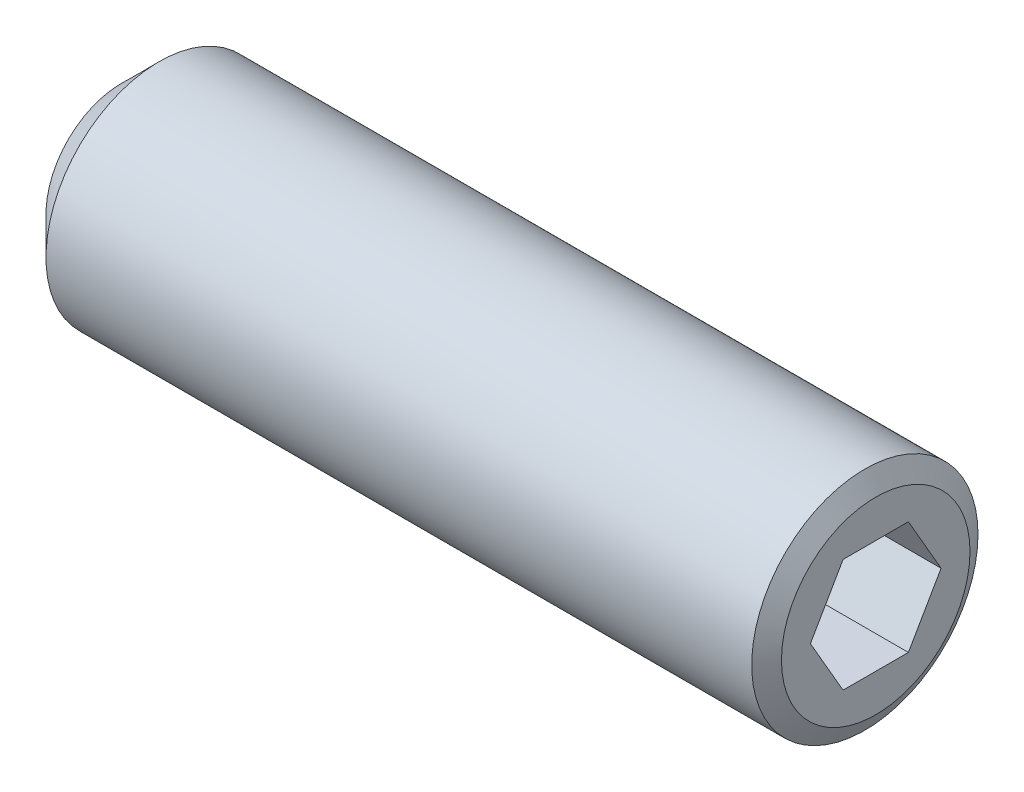
ISO-10303-21;
HEADER;
FILE_DESCRIPTION(('STEP AP214'),'2;1');
FILE_NAME('part.step','',(''),(''),'','','');
FILE_SCHEMA(('AUTOMOTIVE_DESIGN { 1 0 10303 214 1 1 1 1 }'));
ENDSEC;
DATA;
#1=APPLICATION_CONTEXT('core data for automotive mechanical design processes');
#2=APPLICATION_PROTOCOL_DEFINITION('international standard','automotive_design',2000,#1);
#3=PRODUCT_CONTEXT('',#1,'mechanical');
#4=PRODUCT('Part','Part','',(#3));
#5=PRODUCT_RELATED_PRODUCT_CATEGORY('part','',(#4));
#6=PRODUCT_DEFINITION_FORMATION('','',#4);
#7=PRODUCT_DEFINITION_CONTEXT('part definition',#1,'design');
#8=PRODUCT_DEFINITION('design','',#6,#7);
#9=PRODUCT_DEFINITION_SHAPE('','',#8);
#10=(LENGTH_UNIT() NAMED_UNIT(*) SI_UNIT(.MILLI.,.METRE.));
#11=(NAMED_UNIT(*) PLANE_ANGLE_UNIT() SI_UNIT($,.RADIAN.));
#12=(NAMED_UNIT(*) SI_UNIT($,.STERADIAN.) SOLID_ANGLE_UNIT());
#13=UNCERTAINTY_MEASURE_WITH_UNIT(LENGTH_MEASURE(1.E-05),#10,'distance_accuracy_value','');
#14=(GEOMETRIC_REPRESENTATION_CONTEXT(3) GLOBAL_UNCERTAINTY_ASSIGNED_CONTEXT((#13)) GLOBAL_UNIT_ASSIGNED_CONTEXT((#10,
#11,#12)) REPRESENTATION_CONTEXT('',''));
#15=CARTESIAN_POINT('',(0.,0.,0.));
#16=DIRECTION('',(0.,0.,1.));
#17=DIRECTION('',(1.,0.,0.));
#18=AXIS2_PLACEMENT_3D('',#15,#16,#17);
#19=CARTESIAN_POINT('',(0.,0.,0.));
#20=DIRECTION('',(1.,0.,0.));
#21=DIRECTION('',(0.,0.,-1.));
#22=AXIS2_PLACEMENT_3D('',#19,#20,#21);
#23=PLANE('',#22);
#24=CARTESIAN_POINT('',(0.,0.,0.));
#25=DIRECTION('',(1.,0.,0.));
#26=DIRECTION('',(0.,0.,-1.));
#27=AXIS2_PLACEMENT_3D('',#24,#25,#26);
#28=CIRCLE('',#27,2.5);
#29=CARTESIAN_POINT('',(0.,0.,-2.5));
#30=VERTEX_POINT('',#29);
#31=EDGE_CURVE('E44',#30,#30,#28,.T.);
#32=ORIENTED_EDGE('',*,*,#31,.T.);
#33=EDGE_LOOP('',(#32));
#34=FACE_BOUND('',#33,.T.);
#35=DIRECTION('',(0.,0.866025403784439,-0.5));
#36=VECTOR('',#35,1.);
#37=CARTESIAN_POINT('',(0.,-1.5,-0.86602540378444));
#38=LINE('',#37,#36);
#39=CARTESIAN_POINT('',(0.,-1.5,-0.86602540378444));
#40=VERTEX_POINT('',#39);
#41=CARTESIAN_POINT('',(0.,0.,-1.73205080756888));
#42=VERTEX_POINT('',#41);
#43=EDGE_CURVE('E51',#40,#42,#38,.T.);
#44=ORIENTED_EDGE('',*,*,#43,.F.);
#45=DIRECTION('',(0.,0.,-1.));
#46=VECTOR('',#45,1.);
#47=CARTESIAN_POINT('',(0.,-1.5,0.866025403784438));
#48=LINE('',#47,#46);
#49=CARTESIAN_POINT('',(0.,-1.5,0.866025403784438));
#50=VERTEX_POINT('',#49);
#51=EDGE_CURVE('E134',#50,#40,#48,.T.);
#52=ORIENTED_EDGE('',*,*,#51,.F.);
#53=DIRECTION('',(0.,-0.866025403784438,-0.5));
#54=VECTOR('',#53,1.);
#55=CARTESIAN_POINT('',(0.,0.,1.73205080756888));
#56=LINE('',#55,#54);
#57=CARTESIAN_POINT('',(0.,0.,1.73205080756888));
#58=VERTEX_POINT('',#57);
#59=EDGE_CURVE('E132',#58,#50,#56,.T.);
#60=ORIENTED_EDGE('',*,*,#59,.F.);
#61=DIRECTION('',(0.,-0.866025403784439,0.5));
#62=VECTOR('',#61,1.);
#63=CARTESIAN_POINT('',(0.,1.5,0.866025403784439));
#64=LINE('',#63,#62);
#65=CARTESIAN_POINT('',(0.,1.5,0.866025403784439));
#66=VERTEX_POINT('',#65);
#67=EDGE_CURVE('E99',#66,#58,#64,.T.);
#68=ORIENTED_EDGE('',*,*,#67,.F.);
#69=DIRECTION('',(0.,0.,1.));
#70=VECTOR('',#69,1.);
#71=CARTESIAN_POINT('',(0.,1.5,-0.866025403784439));
#72=LINE('',#71,#70);
#73=CARTESIAN_POINT('',(0.,1.5,-0.866025403784439));
#74=VERTEX_POINT('',#73);
#75=EDGE_CURVE('E128',#74,#66,#72,.T.);
#76=ORIENTED_EDGE('',*,*,#75,.F.);
#77=DIRECTION('',(0.,0.866025403784439,0.5));
#78=VECTOR('',#77,1.);
#79=CARTESIAN_POINT('',(0.,0.,-1.73205080756888));
#80=LINE('',#79,#78);
#81=EDGE_CURVE('E125',#42,#74,#80,.T.);
#82=ORIENTED_EDGE('',*,*,#81,.F.);
#83=EDGE_LOOP('',(#44,#52,#60,#68,#76,#82));
#84=FACE_BOUND('',#83,.T.);
#85=ADVANCED_FACE('F36',(#34,#84),#23,.T.);
#86=CARTESIAN_POINT('',(0.,0.,0.));
#87=DIRECTION('',(1.,0.,0.));
#88=DIRECTION('',(0.,0.,-1.));
#89=AXIS2_PLACEMENT_3D('',#86,#87,#88);
#90=CYLINDRICAL_SURFACE('',#89,3.);
#91=CARTESIAN_POINT('',(-0.288675134594812,0.,0.));
#92=DIRECTION('',(1.,0.,0.));
#93=DIRECTION('',(0.,0.,-1.));
#94=AXIS2_PLACEMENT_3D('',#91,#92,#93);
#95=CIRCLE('',#94,3.);
#96=CARTESIAN_POINT('',(-0.288675134594812,0.,-3.));
#97=VERTEX_POINT('',#96);
#98=EDGE_CURVE('E11',#97,#97,#95,.F.);
#99=ORIENTED_EDGE('',*,*,#98,.T.);
#100=EDGE_LOOP('',(#99));
#101=FACE_BOUND('',#100,.T.);
#102=CARTESIAN_POINT('',(-19.,0.,0.));
#103=DIRECTION('',(1.,0.,0.));
#104=DIRECTION('',(0.,0.,-1.));
#105=AXIS2_PLACEMENT_3D('',#102,#103,#104);
#106=CIRCLE('',#105,3.);
#107=CARTESIAN_POINT('',(-19.,0.,-3.));
#108=VERTEX_POINT('',#107);
#109=EDGE_CURVE('E146',#108,#108,#106,.T.);
#110=ORIENTED_EDGE('',*,*,#109,.T.);
#111=EDGE_LOOP('',(#110));
#112=FACE_BOUND('',#111,.T.);
#113=ADVANCED_FACE('F162',(#101,#112),#90,.T.);
#114=CARTESIAN_POINT('',(-19.,0.,0.));
#115=DIRECTION('',(1.,0.,0.));
#116=DIRECTION('',(0.,0.,-1.));
#117=AXIS2_PLACEMENT_3D('',#114,#115,#116);
#118=CONICAL_SURFACE('',#117,3.,0.785398163397453);
#119=CARTESIAN_POINT('',(-20.,0.,0.));
#120=DIRECTION('',(1.,0.,0.));
#121=DIRECTION('',(0.,0.,-1.));
#122=AXIS2_PLACEMENT_3D('',#119,#120,#121);
#123=CIRCLE('',#122,2.);
#124=CARTESIAN_POINT('',(-20.,0.,-2.));
#125=VERTEX_POINT('',#124);
#126=EDGE_CURVE('E138',#125,#125,#123,.T.);
#127=ORIENTED_EDGE('',*,*,#126,.T.);
#128=EDGE_LOOP('',(#127));
#129=FACE_BOUND('',#128,.T.);
#130=ORIENTED_EDGE('',*,*,#109,.F.);
#131=EDGE_LOOP('',(#130));
#132=FACE_BOUND('',#131,.T.);
#133=ADVANCED_FACE('F166',(#129,#132),#118,.T.);
#134=CARTESIAN_POINT('',(-20.,2.,0.));
#135=DIRECTION('',(-1.,0.,0.));
#136=DIRECTION('',(0.,0.,1.));
#137=AXIS2_PLACEMENT_3D('',#134,#135,#136);
#138=PLANE('',#137);
#139=ORIENTED_EDGE('',*,*,#126,.F.);
#140=EDGE_LOOP('',(#139));
#141=FACE_BOUND('',#140,.T.);
#142=ADVANCED_FACE('F172',(#141),#138,.T.);
#143=CARTESIAN_POINT('',(-3.5,-1.5,-0.86602540378444));
#144=DIRECTION('',(0.,-0.5,-0.866025403784439));
#145=DIRECTION('',(0.,0.866025403784439,-0.5));
#146=AXIS2_PLACEMENT_3D('',#143,#144,#145);
#147=PLANE('',#146);
#148=ORIENTED_EDGE('',*,*,#43,.T.);
#149=DIRECTION('',(1.,0.,0.));
#150=VECTOR('',#149,1.);
#151=CARTESIAN_POINT('',(-3.5,0.,-1.73205080756888));
#152=LINE('',#151,#150);
#153=CARTESIAN_POINT('',(-3.5,0.,-1.73205080756888));
#154=VERTEX_POINT('',#153);
#155=EDGE_CURVE('E81',#154,#42,#152,.T.);
#156=ORIENTED_EDGE('',*,*,#155,.F.);
#157=DIRECTION('',(0.,0.866025403784439,-0.5));
#158=VECTOR('',#157,1.);
#159=CARTESIAN_POINT('',(-3.5,-1.5,-0.86602540378444));
#160=LINE('',#159,#158);
#161=CARTESIAN_POINT('',(-3.5,-1.5,-0.86602540378444));
#162=VERTEX_POINT('',#161);
#163=EDGE_CURVE('E136',#162,#154,#160,.T.);
#164=ORIENTED_EDGE('',*,*,#163,.F.);
#165=DIRECTION('',(1.,0.,0.));
#166=VECTOR('',#165,1.);
#167=CARTESIAN_POINT('',(-3.5,-1.5,-0.86602540378444));
#168=LINE('',#167,#166);
#169=EDGE_CURVE('E59',#162,#40,#168,.T.);
#170=ORIENTED_EDGE('',*,*,#169,.T.);
#171=EDGE_LOOP('',(#148,#156,#164,#170));
#172=FACE_BOUND('',#171,.T.);
#173=ADVANCED_FACE('F176',(#172),#147,.F.);
#174=CARTESIAN_POINT('',(-3.5,-1.5,0.866025403784438));
#175=DIRECTION('',(0.,-1.,0.));
#176=DIRECTION('',(1.,0.,0.));
#177=AXIS2_PLACEMENT_3D('',#174,#175,#176);
#178=PLANE('',#177);
#179=ORIENTED_EDGE('',*,*,#51,.T.);
#180=ORIENTED_EDGE('',*,*,#169,.F.);
#181=DIRECTION('',(0.,0.,-1.));
#182=VECTOR('',#181,1.);
#183=CARTESIAN_POINT('',(-3.5,-1.5,0.866025403784438));
#184=LINE('',#183,#182);
#185=CARTESIAN_POINT('',(-3.5,-1.5,0.866025403784438));
#186=VERTEX_POINT('',#185);
#187=EDGE_CURVE('E111',#186,#162,#184,.T.);
#188=ORIENTED_EDGE('',*,*,#187,.F.);
#189=DIRECTION('',(1.,0.,0.));
#190=VECTOR('',#189,1.);
#191=CARTESIAN_POINT('',(-3.5,-1.5,0.866025403784438));
#192=LINE('',#191,#190);
#193=EDGE_CURVE('E103',#186,#50,#192,.T.);
#194=ORIENTED_EDGE('',*,*,#193,.T.);
#195=EDGE_LOOP('',(#179,#180,#188,#194));
#196=FACE_BOUND('',#195,.T.);
#197=ADVANCED_FACE('F180',(#196),#178,.F.);
#198=CARTESIAN_POINT('',(-3.5,0.,1.73205080756888));
#199=DIRECTION('',(0.,-0.5,0.866025403784438));
#200=DIRECTION('',(0.,-0.866025403784439,-0.5));
#201=AXIS2_PLACEMENT_3D('',#198,#199,#200);
#202=PLANE('',#201);
#203=ORIENTED_EDGE('',*,*,#59,.T.);
#204=ORIENTED_EDGE('',*,*,#193,.F.);
#205=DIRECTION('',(0.,-0.866025403784438,-0.5));
#206=VECTOR('',#205,1.);
#207=CARTESIAN_POINT('',(-3.5,0.,1.73205080756888));
#208=LINE('',#207,#206);
#209=CARTESIAN_POINT('',(-3.5,0.,1.73205080756888));
#210=VERTEX_POINT('',#209);
#211=EDGE_CURVE('E107',#210,#186,#208,.T.);
#212=ORIENTED_EDGE('',*,*,#211,.F.);
#213=DIRECTION('',(1.,0.,0.));
#214=VECTOR('',#213,1.);
#215=CARTESIAN_POINT('',(-3.5,0.,1.73205080756888));
#216=LINE('',#215,#214);
#217=EDGE_CURVE('E92',#210,#58,#216,.T.);
#218=ORIENTED_EDGE('',*,*,#217,.T.);
#219=EDGE_LOOP('',(#203,#204,#212,#218));
#220=FACE_BOUND('',#219,.T.);
#221=ADVANCED_FACE('F108',(#220),#202,.F.);
#222=CARTESIAN_POINT('',(-3.5,1.5,0.866025403784439));
#223=DIRECTION('',(0.,0.5,0.866025403784439));
#224=DIRECTION('',(0.,-0.866025403784439,0.5));
#225=AXIS2_PLACEMENT_3D('',#222,#223,#224);
#226=PLANE('',#225);
#227=ORIENTED_EDGE('',*,*,#67,.T.);
#228=ORIENTED_EDGE('',*,*,#217,.F.);
#229=DIRECTION('',(0.,-0.866025403784439,0.5));
#230=VECTOR('',#229,1.);
#231=CARTESIAN_POINT('',(-3.5,1.5,0.866025403784439));
#232=LINE('',#231,#230);
#233=CARTESIAN_POINT('',(-3.5,1.5,0.866025403784439));
#234=VERTEX_POINT('',#233);
#235=EDGE_CURVE('E96',#234,#210,#232,.T.);
#236=ORIENTED_EDGE('',*,*,#235,.F.);
#237=DIRECTION('',(1.,0.,0.));
#238=VECTOR('',#237,1.);
#239=CARTESIAN_POINT('',(-3.5,1.5,0.866025403784439));
#240=LINE('',#239,#238);
#241=EDGE_CURVE('E104',#234,#66,#240,.T.);
#242=ORIENTED_EDGE('',*,*,#241,.T.);
#243=EDGE_LOOP('',(#227,#228,#236,#242));
#244=FACE_BOUND('',#243,.T.);
#245=ADVANCED_FACE('F94',(#244),#226,.F.);
#246=CARTESIAN_POINT('',(-3.5,1.5,-0.866025403784439));
#247=DIRECTION('',(0.,1.,0.));
#248=DIRECTION('',(0.,0.,1.));
#249=AXIS2_PLACEMENT_3D('',#246,#247,#248);
#250=PLANE('',#249);
#251=ORIENTED_EDGE('',*,*,#75,.T.);
#252=ORIENTED_EDGE('',*,*,#241,.F.);
#253=DIRECTION('',(0.,0.,1.));
#254=VECTOR('',#253,1.);
#255=CARTESIAN_POINT('',(-3.5,1.5,-0.866025403784439));
#256=LINE('',#255,#254);
#257=CARTESIAN_POINT('',(-3.5,1.5,-0.866025403784439));
#258=VERTEX_POINT('',#257);
#259=EDGE_CURVE('E117',#258,#234,#256,.T.);
#260=ORIENTED_EDGE('',*,*,#259,.F.);
#261=DIRECTION('',(1.,0.,0.));
#262=VECTOR('',#261,1.);
#263=CARTESIAN_POINT('',(-3.5,1.5,-0.866025403784439));
#264=LINE('',#263,#262);
#265=EDGE_CURVE('E141',#258,#74,#264,.T.);
#266=ORIENTED_EDGE('',*,*,#265,.T.);
#267=EDGE_LOOP('',(#251,#252,#260,#266));
#268=FACE_BOUND('',#267,.T.);
#269=ADVANCED_FACE('F183',(#268),#250,.F.);
#270=CARTESIAN_POINT('',(-3.5,0.,-1.73205080756888));
#271=DIRECTION('',(0.,0.5,-0.866025403784438));
#272=DIRECTION('',(0.,0.866025403784439,0.5));
#273=AXIS2_PLACEMENT_3D('',#270,#271,#272);
#274=PLANE('',#273);
#275=ORIENTED_EDGE('',*,*,#81,.T.);
#276=ORIENTED_EDGE('',*,*,#265,.F.);
#277=DIRECTION('',(0.,0.866025403784439,0.5));
#278=VECTOR('',#277,1.);
#279=CARTESIAN_POINT('',(-3.5,0.,-1.73205080756888));
#280=LINE('',#279,#278);
#281=EDGE_CURVE('E119',#154,#258,#280,.T.);
#282=ORIENTED_EDGE('',*,*,#281,.F.);
#283=ORIENTED_EDGE('',*,*,#155,.T.);
#284=EDGE_LOOP('',(#275,#276,#282,#283));
#285=FACE_BOUND('',#284,.T.);
#286=ADVANCED_FACE('F158',(#285),#274,.F.);
#287=CARTESIAN_POINT('',(-3.5,-3.,0.));
#288=DIRECTION('',(-1.,0.,0.));
#289=DIRECTION('',(0.,-1.,0.));
#290=AXIS2_PLACEMENT_3D('',#287,#288,#289);
#291=PLANE('',#290);
#292=ORIENTED_EDGE('',*,*,#163,.T.);
#293=ORIENTED_EDGE('',*,*,#281,.T.);
#294=ORIENTED_EDGE('',*,*,#259,.T.);
#295=ORIENTED_EDGE('',*,*,#235,.T.);
#296=ORIENTED_EDGE('',*,*,#211,.T.);
#297=ORIENTED_EDGE('',*,*,#187,.T.);
#298=EDGE_LOOP('',(#292,#293,#294,#295,#296,#297));
#299=FACE_BOUND('',#298,.T.);
#300=ADVANCED_FACE('F114',(#299),#291,.F.);
#301=CARTESIAN_POINT('',(0.,0.,0.));
#302=DIRECTION('',(-1.,0.,0.));
#303=DIRECTION('',(0.,0.,1.));
#304=AXIS2_PLACEMENT_3D('',#301,#302,#303);
#305=CONICAL_SURFACE('',#304,2.5,1.0471975511966);
#306=ORIENTED_EDGE('',*,*,#98,.F.);
#307=EDGE_LOOP('',(#306));
#308=FACE_BOUND('',#307,.T.);
#309=ORIENTED_EDGE('',*,*,#31,.F.);
#310=EDGE_LOOP('',(#309));
#311=FACE_BOUND('',#310,.T.);
#312=ADVANCED_FACE('F38',(#308,#311),#305,.T.);
#313=CLOSED_SHELL('',(#85,#113,#133,#142,#173,#197,#221,#245,#269,#286,#300,#312));
#314=MANIFOLD_SOLID_BREP('B2',#313);
#315=ADVANCED_BREP_SHAPE_REPRESENTATION('',(#18,#314),#14);
#316=SHAPE_DEFINITION_REPRESENTATION(#9,#315);
ENDSEC;
END-ISO-10303-21;
